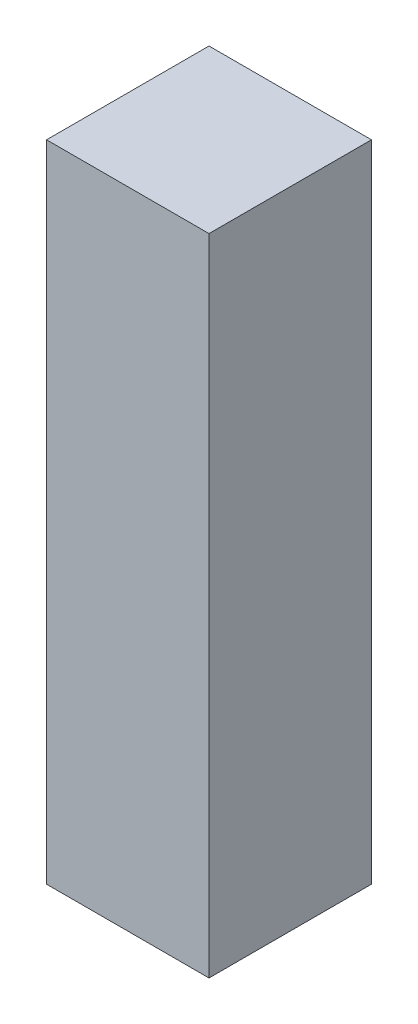
ISO-10303-21;
HEADER;
FILE_DESCRIPTION(('STEP AP214'),'2;1');
FILE_NAME('part.step','',(''),(''),'','','');
FILE_SCHEMA(('AUTOMOTIVE_DESIGN { 1 0 10303 214 1 1 1 1 }'));
ENDSEC;
DATA;
#1=APPLICATION_CONTEXT('core data for automotive mechanical design processes');
#2=APPLICATION_PROTOCOL_DEFINITION('international standard','automotive_design',2000,#1);
#3=PRODUCT_CONTEXT('',#1,'mechanical');
#4=PRODUCT('Part','Part','',(#3));
#5=PRODUCT_RELATED_PRODUCT_CATEGORY('part','',(#4));
#6=PRODUCT_DEFINITION_FORMATION('','',#4);
#7=PRODUCT_DEFINITION_CONTEXT('part definition',#1,'design');
#8=PRODUCT_DEFINITION('design','',#6,#7);
#9=PRODUCT_DEFINITION_SHAPE('','',#8);
#10=(LENGTH_UNIT() NAMED_UNIT(*) SI_UNIT(.MILLI.,.METRE.));
#11=(NAMED_UNIT(*) PLANE_ANGLE_UNIT() SI_UNIT($,.RADIAN.));
#12=(NAMED_UNIT(*) SI_UNIT($,.STERADIAN.) SOLID_ANGLE_UNIT());
#13=UNCERTAINTY_MEASURE_WITH_UNIT(LENGTH_MEASURE(1.E-05),#10,'distance_accuracy_value','');
#14=(GEOMETRIC_REPRESENTATION_CONTEXT(3) GLOBAL_UNCERTAINTY_ASSIGNED_CONTEXT((#13)) GLOBAL_UNIT_ASSIGNED_CONTEXT((#10,
#11,#12)) REPRESENTATION_CONTEXT('',''));
#15=CARTESIAN_POINT('',(0.,0.,0.));
#16=DIRECTION('',(0.,0.,1.));
#17=DIRECTION('',(1.,0.,0.));
#18=AXIS2_PLACEMENT_3D('',#15,#16,#17);
#19=CARTESIAN_POINT('',(-6.029999985099,-2.,-0.32));
#20=DIRECTION('',(0.,0.,-1.));
#21=DIRECTION('',(-1.,0.,0.));
#22=AXIS2_PLACEMENT_3D('',#19,#20,#21);
#23=PLANE('',#22);
#24=DIRECTION('',(1.,0.,0.));
#25=VECTOR('',#24,1.);
#26=CARTESIAN_POINT('',(-8.89,2.54,-0.32));
#27=LINE('',#26,#25);
#28=CARTESIAN_POINT('',(-6.029999985099,2.54,-0.32));
#29=VERTEX_POINT('',#28);
#30=CARTESIAN_POINT('',(-6.669999985099,2.54,-0.32));
#31=VERTEX_POINT('',#30);
#32=EDGE_CURVE('E54',#29,#31,#27,.F.);
#33=ORIENTED_EDGE('',*,*,#32,.F.);
#34=DIRECTION('',(0.,1.,0.));
#35=VECTOR('',#34,1.);
#36=CARTESIAN_POINT('',(-6.029999985099,-2.,-0.32));
#37=LINE('',#36,#35);
#38=CARTESIAN_POINT('',(-6.029999985099,0.,-0.32));
#39=VERTEX_POINT('',#38);
#40=EDGE_CURVE('E66',#39,#29,#37,.T.);
#41=ORIENTED_EDGE('',*,*,#40,.F.);
#42=DIRECTION('',(1.,0.,0.));
#43=VECTOR('',#42,1.);
#44=CARTESIAN_POINT('',(-1.27,0.,-0.32));
#45=LINE('',#44,#43);
#46=CARTESIAN_POINT('',(-6.669999985099,0.,-0.32));
#47=VERTEX_POINT('',#46);
#48=EDGE_CURVE('E19',#39,#47,#45,.F.);
#49=ORIENTED_EDGE('',*,*,#48,.T.);
#50=DIRECTION('',(0.,1.,0.));
#51=VECTOR('',#50,1.);
#52=CARTESIAN_POINT('',(-6.669999985099,-2.,-0.32));
#53=LINE('',#52,#51);
#54=EDGE_CURVE('E80',#31,#47,#53,.F.);
#55=ORIENTED_EDGE('',*,*,#54,.F.);
#56=EDGE_LOOP('',(#33,#41,#49,#55));
#57=FACE_BOUND('',#56,.T.);
#58=ADVANCED_FACE('F16',(#57),#23,.T.);
#59=CARTESIAN_POINT('',(-1.27,0.,0.));
#60=DIRECTION('',(0.,1.,0.));
#61=DIRECTION('',(0.,0.,1.));
#62=AXIS2_PLACEMENT_3D('',#59,#60,#61);
#63=PLANE('',#62);
#64=DIRECTION('',(1.,0.,0.));
#65=VECTOR('',#64,1.);
#66=CARTESIAN_POINT('',(-6.669999985099,0.,0.32));
#67=LINE('',#66,#65);
#68=CARTESIAN_POINT('',(-6.669999985099,0.,0.32));
#69=VERTEX_POINT('',#68);
#70=CARTESIAN_POINT('',(-6.029999985099,0.,0.32));
#71=VERTEX_POINT('',#70);
#72=EDGE_CURVE('E82',#69,#71,#67,.T.);
#73=ORIENTED_EDGE('',*,*,#72,.F.);
#74=DIRECTION('',(0.,0.,1.));
#75=VECTOR('',#74,1.);
#76=CARTESIAN_POINT('',(-6.669999985099,0.,-0.32));
#77=LINE('',#76,#75);
#78=EDGE_CURVE('E64',#47,#69,#77,.T.);
#79=ORIENTED_EDGE('',*,*,#78,.F.);
#80=ORIENTED_EDGE('',*,*,#48,.F.);
#81=DIRECTION('',(0.,0.,-1.));
#82=VECTOR('',#81,1.);
#83=CARTESIAN_POINT('',(-6.029999985099,0.,0.32));
#84=LINE('',#83,#82);
#85=EDGE_CURVE('E61',#71,#39,#84,.T.);
#86=ORIENTED_EDGE('',*,*,#85,.F.);
#87=EDGE_LOOP('',(#73,#79,#80,#86));
#88=FACE_BOUND('',#87,.T.);
#89=ADVANCED_FACE('F59',(#88),#63,.F.);
#90=CARTESIAN_POINT('',(-6.029999985099,-2.,0.32));
#91=DIRECTION('',(1.,0.,0.));
#92=DIRECTION('',(0.,0.,-1.));
#93=AXIS2_PLACEMENT_3D('',#90,#91,#92);
#94=PLANE('',#93);
#95=DIRECTION('',(0.,0.,1.));
#96=VECTOR('',#95,1.);
#97=CARTESIAN_POINT('',(-6.029999985099,2.54,0.));
#98=LINE('',#97,#96);
#99=CARTESIAN_POINT('',(-6.029999985099,2.54,0.32));
#100=VERTEX_POINT('',#99);
#101=EDGE_CURVE('E76',#100,#29,#98,.F.);
#102=ORIENTED_EDGE('',*,*,#101,.F.);
#103=DIRECTION('',(0.,1.,0.));
#104=VECTOR('',#103,1.);
#105=CARTESIAN_POINT('',(-6.029999985099,-2.,0.32));
#106=LINE('',#105,#104);
#107=EDGE_CURVE('E72',#71,#100,#106,.T.);
#108=ORIENTED_EDGE('',*,*,#107,.F.);
#109=ORIENTED_EDGE('',*,*,#85,.T.);
#110=ORIENTED_EDGE('',*,*,#40,.T.);
#111=EDGE_LOOP('',(#102,#108,#109,#110));
#112=FACE_BOUND('',#111,.T.);
#113=ADVANCED_FACE('F70',(#112),#94,.T.);
#114=CARTESIAN_POINT('',(-8.89,2.54,0.));
#115=DIRECTION('',(0.,1.,0.));
#116=DIRECTION('',(0.,0.,1.));
#117=AXIS2_PLACEMENT_3D('',#114,#115,#116);
#118=PLANE('',#117);
#119=DIRECTION('',(1.,0.,0.));
#120=VECTOR('',#119,1.);
#121=CARTESIAN_POINT('',(-6.669999985099,2.54,0.32));
#122=LINE('',#121,#120);
#123=CARTESIAN_POINT('',(-6.669999985099,2.54,0.32));
#124=VERTEX_POINT('',#123);
#125=EDGE_CURVE('E25',#100,#124,#122,.F.);
#126=ORIENTED_EDGE('',*,*,#125,.F.);
#127=ORIENTED_EDGE('',*,*,#101,.T.);
#128=ORIENTED_EDGE('',*,*,#32,.T.);
#129=DIRECTION('',(0.,0.,1.));
#130=VECTOR('',#129,1.);
#131=CARTESIAN_POINT('',(-6.669999985099,2.54,-0.32));
#132=LINE('',#131,#130);
#133=EDGE_CURVE('E34',#124,#31,#132,.F.);
#134=ORIENTED_EDGE('',*,*,#133,.F.);
#135=EDGE_LOOP('',(#126,#127,#128,#134));
#136=FACE_BOUND('',#135,.T.);
#137=ADVANCED_FACE('F88',(#136),#118,.T.);
#138=CARTESIAN_POINT('',(-6.669999985099,-2.,-0.32));
#139=DIRECTION('',(-1.,0.,0.));
#140=DIRECTION('',(0.,0.,1.));
#141=AXIS2_PLACEMENT_3D('',#138,#139,#140);
#142=PLANE('',#141);
#143=ORIENTED_EDGE('',*,*,#133,.T.);
#144=ORIENTED_EDGE('',*,*,#54,.T.);
#145=ORIENTED_EDGE('',*,*,#78,.T.);
#146=DIRECTION('',(0.,1.,0.));
#147=VECTOR('',#146,1.);
#148=CARTESIAN_POINT('',(-6.669999985099,-2.,0.32));
#149=LINE('',#148,#147);
#150=EDGE_CURVE('E10',#124,#69,#149,.F.);
#151=ORIENTED_EDGE('',*,*,#150,.F.);
#152=EDGE_LOOP('',(#143,#144,#145,#151));
#153=FACE_BOUND('',#152,.T.);
#154=ADVANCED_FACE('F90',(#153),#142,.T.);
#155=CARTESIAN_POINT('',(-6.669999985099,-2.,0.32));
#156=DIRECTION('',(0.,0.,1.));
#157=DIRECTION('',(1.,0.,0.));
#158=AXIS2_PLACEMENT_3D('',#155,#156,#157);
#159=PLANE('',#158);
#160=ORIENTED_EDGE('',*,*,#125,.T.);
#161=ORIENTED_EDGE('',*,*,#150,.T.);
#162=ORIENTED_EDGE('',*,*,#72,.T.);
#163=ORIENTED_EDGE('',*,*,#107,.T.);
#164=EDGE_LOOP('',(#160,#161,#162,#163));
#165=FACE_BOUND('',#164,.T.);
#166=ADVANCED_FACE('F87',(#165),#159,.T.);
#167=CLOSED_SHELL('',(#58,#89,#113,#137,#154,#166));
#168=MANIFOLD_SOLID_BREP('B1',#167);
#169=ADVANCED_BREP_SHAPE_REPRESENTATION('',(#18,#168),#14);
#170=SHAPE_DEFINITION_REPRESENTATION(#9,#169);
ENDSEC;
END-ISO-10303-21;
